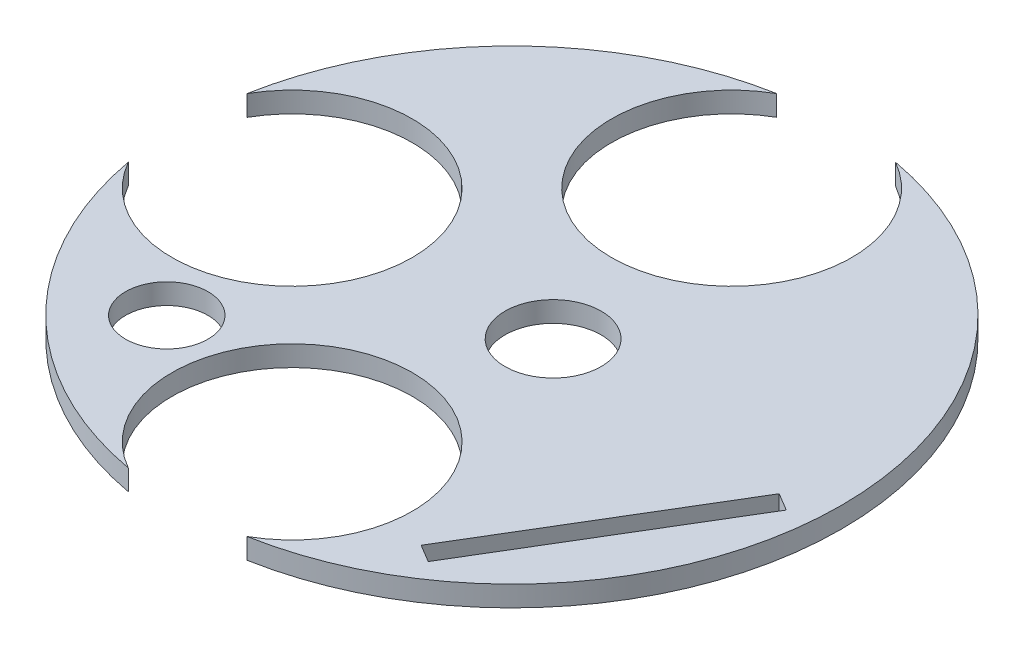
ISO-10303-21;
HEADER;
FILE_DESCRIPTION(('STEP AP214'),'2;1');
FILE_NAME('part.step','',(''),(''),'','','');
FILE_SCHEMA(('AUTOMOTIVE_DESIGN { 1 0 10303 214 1 1 1 1 }'));
ENDSEC;
DATA;
#1=APPLICATION_CONTEXT('core data for automotive mechanical design processes');
#2=APPLICATION_PROTOCOL_DEFINITION('international standard','automotive_design',2000,#1);
#3=PRODUCT_CONTEXT('',#1,'mechanical');
#4=PRODUCT('Part','Part','',(#3));
#5=PRODUCT_RELATED_PRODUCT_CATEGORY('part','',(#4));
#6=PRODUCT_DEFINITION_FORMATION('','',#4);
#7=PRODUCT_DEFINITION_CONTEXT('part definition',#1,'design');
#8=PRODUCT_DEFINITION('design','',#6,#7);
#9=PRODUCT_DEFINITION_SHAPE('','',#8);
#10=(LENGTH_UNIT() NAMED_UNIT(*) SI_UNIT(.MILLI.,.METRE.));
#11=(NAMED_UNIT(*) PLANE_ANGLE_UNIT() SI_UNIT($,.RADIAN.));
#12=(NAMED_UNIT(*) SI_UNIT($,.STERADIAN.) SOLID_ANGLE_UNIT());
#13=UNCERTAINTY_MEASURE_WITH_UNIT(LENGTH_MEASURE(1.E-05),#10,'distance_accuracy_value','');
#14=(GEOMETRIC_REPRESENTATION_CONTEXT(3) GLOBAL_UNCERTAINTY_ASSIGNED_CONTEXT((#13)) GLOBAL_UNIT_ASSIGNED_CONTEXT((#10,
#11,#12)) REPRESENTATION_CONTEXT('',''));
#15=CARTESIAN_POINT('',(0.,0.,0.));
#16=DIRECTION('',(0.,0.,1.));
#17=DIRECTION('',(1.,0.,0.));
#18=AXIS2_PLACEMENT_3D('',#15,#16,#17);
#19=CARTESIAN_POINT('',(4.89286171164571,1.5,-8.14308935667015));
#20=DIRECTION('',(-0.515038074910066,0.,0.857167300702105));
#21=DIRECTION('',(0.857167300702105,0.,0.515038074910066));
#22=AXIS2_PLACEMENT_3D('',#19,#20,#21);
#23=PLANE('',#22);
#24=DIRECTION('',(-0.857167300702105,0.,-0.515038074910066));
#25=VECTOR('',#24,1.);
#26=CARTESIAN_POINT('',(4.89286171164571,0.,-8.14308935667015));
#27=LINE('',#26,#25);
#28=CARTESIAN_POINT('',(22.2857509510532,0.,2.30761283839832));
#29=VERTEX_POINT('',#28);
#30=CARTESIAN_POINT('',(21.,0.,1.53505572603322));
#31=VERTEX_POINT('',#30);
#32=EDGE_CURVE('E180',#29,#31,#27,.T.);
#33=ORIENTED_EDGE('',*,*,#32,.F.);
#34=DIRECTION('',(0.,-1.,0.));
#35=VECTOR('',#34,1.);
#36=CARTESIAN_POINT('',(22.2857509510532,1.5,2.30761283839832));
#37=LINE('',#36,#35);
#38=CARTESIAN_POINT('',(22.2857509510532,1.5,2.30761283839832));
#39=VERTEX_POINT('',#38);
#40=EDGE_CURVE('E11',#39,#29,#37,.T.);
#41=ORIENTED_EDGE('',*,*,#40,.F.);
#42=DIRECTION('',(-0.857167300702105,0.,-0.515038074910066));
#43=VECTOR('',#42,1.);
#44=CARTESIAN_POINT('',(4.89286171164571,1.5,-8.14308935667015));
#45=LINE('',#44,#43);
#46=CARTESIAN_POINT('',(21.,1.5,1.53505572603322));
#47=VERTEX_POINT('',#46);
#48=EDGE_CURVE('E142',#39,#47,#45,.T.);
#49=ORIENTED_EDGE('',*,*,#48,.T.);
#50=DIRECTION('',(0.,-1.,0.));
#51=VECTOR('',#50,1.);
#52=CARTESIAN_POINT('',(21.,1.5,1.53505572603322));
#53=LINE('',#52,#51);
#54=EDGE_CURVE('E61',#47,#31,#53,.T.);
#55=ORIENTED_EDGE('',*,*,#54,.T.);
#56=EDGE_LOOP('',(#33,#41,#49,#55));
#57=FACE_BOUND('',#56,.T.);
#58=ADVANCED_FACE('F41',(#57),#23,.T.);
#59=CARTESIAN_POINT('',(17.3928892394076,1.5,10.4507021950684));
#60=DIRECTION('',(-0.85716730070211,0.,-0.515038074910059));
#61=DIRECTION('',(-0.515038074910059,0.,0.85716730070211));
#62=AXIS2_PLACEMENT_3D('',#59,#60,#61);
#63=PLANE('',#62);
#64=DIRECTION('',(0.515038074910059,0.,-0.85716730070211));
#65=VECTOR('',#64,1.);
#66=CARTESIAN_POINT('',(17.3928892394076,0.,10.4507021950684));
#67=LINE('',#66,#65);
#68=CARTESIAN_POINT('',(12.500027527762,0.,18.5937915517384));
#69=VERTEX_POINT('',#68);
#70=EDGE_CURVE('E130',#69,#29,#67,.T.);
#71=ORIENTED_EDGE('',*,*,#70,.F.);
#72=DIRECTION('',(0.,-1.,0.));
#73=VECTOR('',#72,1.);
#74=CARTESIAN_POINT('',(12.500027527762,1.5,18.5937915517384));
#75=LINE('',#74,#73);
#76=CARTESIAN_POINT('',(12.500027527762,1.5,18.5937915517384));
#77=VERTEX_POINT('',#76);
#78=EDGE_CURVE('E52',#77,#69,#75,.T.);
#79=ORIENTED_EDGE('',*,*,#78,.F.);
#80=DIRECTION('',(0.515038074910059,0.,-0.85716730070211));
#81=VECTOR('',#80,1.);
#82=CARTESIAN_POINT('',(17.3928892394076,1.5,10.4507021950684));
#83=LINE('',#82,#81);
#84=EDGE_CURVE('E128',#77,#39,#83,.T.);
#85=ORIENTED_EDGE('',*,*,#84,.T.);
#86=ORIENTED_EDGE('',*,*,#40,.T.);
#87=EDGE_LOOP('',(#71,#79,#85,#86));
#88=FACE_BOUND('',#87,.T.);
#89=ADVANCED_FACE('F127',(#88),#63,.T.);
#90=CARTESIAN_POINT('',(-4.89286171164558,1.5,8.14308935667026));
#91=DIRECTION('',(0.51503807491005,0.,-0.857167300702115));
#92=DIRECTION('',(-0.857167300702115,0.,-0.51503807491005));
#93=AXIS2_PLACEMENT_3D('',#90,#91,#92);
#94=PLANE('',#93);
#95=DIRECTION('',(0.857167300702115,0.,0.51503807491005));
#96=VECTOR('',#95,1.);
#97=CARTESIAN_POINT('',(-4.89286171164558,0.,8.14308935667026));
#98=LINE('',#97,#96);
#99=CARTESIAN_POINT('',(11.2142765767089,0.,17.8212344393733));
#100=VERTEX_POINT('',#99);
#101=EDGE_CURVE('E185',#100,#69,#98,.T.);
#102=ORIENTED_EDGE('',*,*,#101,.F.);
#103=DIRECTION('',(0.,-1.,0.));
#104=VECTOR('',#103,1.);
#105=CARTESIAN_POINT('',(11.2142765767089,1.5,17.8212344393733));
#106=LINE('',#105,#104);
#107=CARTESIAN_POINT('',(11.2142765767089,1.5,17.8212344393733));
#108=VERTEX_POINT('',#107);
#109=EDGE_CURVE('E92',#108,#100,#106,.T.);
#110=ORIENTED_EDGE('',*,*,#109,.F.);
#111=DIRECTION('',(0.857167300702115,0.,0.51503807491005));
#112=VECTOR('',#111,1.);
#113=CARTESIAN_POINT('',(-4.89286171164558,1.5,8.14308935667026));
#114=LINE('',#113,#112);
#115=EDGE_CURVE('E141',#108,#77,#114,.T.);
#116=ORIENTED_EDGE('',*,*,#115,.T.);
#117=ORIENTED_EDGE('',*,*,#78,.T.);
#118=EDGE_LOOP('',(#102,#110,#116,#117));
#119=FACE_BOUND('',#118,.T.);
#120=ADVANCED_FACE('F145',(#119),#94,.T.);
#121=CARTESIAN_POINT('',(0.,1.5,16.));
#122=DIRECTION('',(0.,-1.,0.));
#123=DIRECTION('',(0.,0.,-1.));
#124=AXIS2_PLACEMENT_3D('',#121,#122,#123);
#125=CYLINDRICAL_SURFACE('',#124,8.75);
#126=CARTESIAN_POINT('',(0.,0.,16.));
#127=DIRECTION('',(0.,1.,0.));
#128=DIRECTION('',(0.,0.,1.));
#129=AXIS2_PLACEMENT_3D('',#126,#127,#128);
#130=CIRCLE('',#129,8.75);
#131=CARTESIAN_POINT('',(4.3231507509884,0.,23.607421875));
#132=VERTEX_POINT('',#131);
#133=CARTESIAN_POINT('',(-4.3231507509884,0.,23.607421875));
#134=VERTEX_POINT('',#133);
#135=EDGE_CURVE('E154',#132,#134,#130,.T.);
#136=ORIENTED_EDGE('',*,*,#135,.F.);
#137=DIRECTION('',(0.,-1.,0.));
#138=VECTOR('',#137,1.);
#139=CARTESIAN_POINT('',(4.3231507509884,1.5,23.607421875));
#140=LINE('',#139,#138);
#141=CARTESIAN_POINT('',(4.3231507509884,1.5,23.607421875));
#142=VERTEX_POINT('',#141);
#143=EDGE_CURVE('E45',#142,#132,#140,.T.);
#144=ORIENTED_EDGE('',*,*,#143,.F.);
#145=CARTESIAN_POINT('',(0.,1.5,16.));
#146=DIRECTION('',(0.,1.,0.));
#147=DIRECTION('',(0.,0.,1.));
#148=AXIS2_PLACEMENT_3D('',#145,#146,#147);
#149=CIRCLE('',#148,8.75);
#150=CARTESIAN_POINT('',(-4.3231507509884,1.5,23.607421875));
#151=VERTEX_POINT('',#150);
#152=EDGE_CURVE('E192',#142,#151,#149,.T.);
#153=ORIENTED_EDGE('',*,*,#152,.T.);
#154=DIRECTION('',(0.,-1.,0.));
#155=VECTOR('',#154,1.);
#156=CARTESIAN_POINT('',(-4.3231507509884,1.5,23.607421875));
#157=LINE('',#156,#155);
#158=EDGE_CURVE('E150',#151,#134,#157,.T.);
#159=ORIENTED_EDGE('',*,*,#158,.T.);
#160=EDGE_LOOP('',(#136,#144,#153,#159));
#161=FACE_BOUND('',#160,.T.);
#162=ADVANCED_FACE('F43',(#161),#125,.F.);
#163=CARTESIAN_POINT('',(0.,1.5,0.));
#164=DIRECTION('',(0.,-1.,0.));
#165=DIRECTION('',(0.,0.,-1.));
#166=AXIS2_PLACEMENT_3D('',#163,#164,#165);
#167=CYLINDRICAL_SURFACE('',#166,24.);
#168=CARTESIAN_POINT('',(0.,0.,0.));
#169=DIRECTION('',(0.,1.,0.));
#170=DIRECTION('',(0.,0.,1.));
#171=AXIS2_PLACEMENT_3D('',#168,#169,#170);
#172=CIRCLE('',#171,24.);
#173=CARTESIAN_POINT('',(4.3231507509884,0.,-23.607421875));
#174=VERTEX_POINT('',#173);
#175=EDGE_CURVE('E158',#132,#174,#172,.T.);
#176=ORIENTED_EDGE('',*,*,#175,.T.);
#177=DIRECTION('',(0.,-1.,0.));
#178=VECTOR('',#177,1.);
#179=CARTESIAN_POINT('',(4.3231507509884,1.5,-23.607421875));
#180=LINE('',#179,#178);
#181=CARTESIAN_POINT('',(4.3231507509884,1.5,-23.607421875));
#182=VERTEX_POINT('',#181);
#183=EDGE_CURVE('E207',#182,#174,#180,.T.);
#184=ORIENTED_EDGE('',*,*,#183,.F.);
#185=CARTESIAN_POINT('',(0.,1.5,0.));
#186=DIRECTION('',(0.,1.,0.));
#187=DIRECTION('',(0.,0.,1.));
#188=AXIS2_PLACEMENT_3D('',#185,#186,#187);
#189=CIRCLE('',#188,24.);
#190=EDGE_CURVE('E217',#142,#182,#189,.T.);
#191=ORIENTED_EDGE('',*,*,#190,.F.);
#192=ORIENTED_EDGE('',*,*,#143,.T.);
#193=EDGE_LOOP('',(#176,#184,#191,#192));
#194=FACE_BOUND('',#193,.T.);
#195=ADVANCED_FACE('F216',(#194),#167,.T.);
#196=CARTESIAN_POINT('',(0.,1.5,-16.));
#197=DIRECTION('',(0.,-1.,0.));
#198=DIRECTION('',(0.,0.,-1.));
#199=AXIS2_PLACEMENT_3D('',#196,#197,#198);
#200=CYLINDRICAL_SURFACE('',#199,8.75);
#201=CARTESIAN_POINT('',(0.,0.,-16.));
#202=DIRECTION('',(0.,1.,0.));
#203=DIRECTION('',(0.,0.,1.));
#204=AXIS2_PLACEMENT_3D('',#201,#202,#203);
#205=CIRCLE('',#204,8.75);
#206=CARTESIAN_POINT('',(-4.3231507509884,0.,-23.607421875));
#207=VERTEX_POINT('',#206);
#208=EDGE_CURVE('E162',#207,#174,#205,.T.);
#209=ORIENTED_EDGE('',*,*,#208,.F.);
#210=DIRECTION('',(0.,-1.,0.));
#211=VECTOR('',#210,1.);
#212=CARTESIAN_POINT('',(-4.3231507509884,1.5,-23.607421875));
#213=LINE('',#212,#211);
#214=CARTESIAN_POINT('',(-4.3231507509884,1.5,-23.607421875));
#215=VERTEX_POINT('',#214);
#216=EDGE_CURVE('E205',#215,#207,#213,.T.);
#217=ORIENTED_EDGE('',*,*,#216,.F.);
#218=CARTESIAN_POINT('',(0.,1.5,-16.));
#219=DIRECTION('',(0.,1.,0.));
#220=DIRECTION('',(0.,0.,1.));
#221=AXIS2_PLACEMENT_3D('',#218,#219,#220);
#222=CIRCLE('',#221,8.75);
#223=EDGE_CURVE('E251',#215,#182,#222,.T.);
#224=ORIENTED_EDGE('',*,*,#223,.T.);
#225=ORIENTED_EDGE('',*,*,#183,.T.);
#226=EDGE_LOOP('',(#209,#217,#224,#225));
#227=FACE_BOUND('',#226,.T.);
#228=ADVANCED_FACE('F288',(#227),#200,.F.);
#229=CARTESIAN_POINT('',(-23.607421875,0.,-4.32315075098838));
#230=VERTEX_POINT('',#229);
#231=EDGE_CURVE('E164',#207,#230,#172,.T.);
#232=ORIENTED_EDGE('',*,*,#231,.T.);
#233=DIRECTION('',(0.,-1.,0.));
#234=VECTOR('',#233,1.);
#235=CARTESIAN_POINT('',(-23.607421875,1.5,-4.32315075098838));
#236=LINE('',#235,#234);
#237=CARTESIAN_POINT('',(-23.607421875,1.5,-4.32315075098838));
#238=VERTEX_POINT('',#237);
#239=EDGE_CURVE('E202',#238,#230,#236,.T.);
#240=ORIENTED_EDGE('',*,*,#239,.F.);
#241=EDGE_CURVE('E245',#215,#238,#189,.T.);
#242=ORIENTED_EDGE('',*,*,#241,.F.);
#243=ORIENTED_EDGE('',*,*,#216,.T.);
#244=EDGE_LOOP('',(#232,#240,#242,#243));
#245=FACE_BOUND('',#244,.T.);
#246=ADVANCED_FACE('F235',(#245),#167,.T.);
#247=CARTESIAN_POINT('',(-16.,1.5,0.));
#248=DIRECTION('',(0.,-1.,0.));
#249=DIRECTION('',(0.,0.,-1.));
#250=AXIS2_PLACEMENT_3D('',#247,#248,#249);
#251=CYLINDRICAL_SURFACE('',#250,8.75);
#252=CARTESIAN_POINT('',(-16.,0.,0.));
#253=DIRECTION('',(0.,1.,0.));
#254=DIRECTION('',(0.,0.,1.));
#255=AXIS2_PLACEMENT_3D('',#252,#253,#254);
#256=CIRCLE('',#255,8.75);
#257=CARTESIAN_POINT('',(-23.607421875,0.,4.32315075098839));
#258=VERTEX_POINT('',#257);
#259=EDGE_CURVE('E168',#258,#230,#256,.T.);
#260=ORIENTED_EDGE('',*,*,#259,.F.);
#261=DIRECTION('',(0.,-1.,0.));
#262=VECTOR('',#261,1.);
#263=CARTESIAN_POINT('',(-23.607421875,1.5,4.32315075098839));
#264=LINE('',#263,#262);
#265=CARTESIAN_POINT('',(-23.607421875,1.5,4.32315075098839));
#266=VERTEX_POINT('',#265);
#267=EDGE_CURVE('E199',#266,#258,#264,.T.);
#268=ORIENTED_EDGE('',*,*,#267,.F.);
#269=CARTESIAN_POINT('',(-16.,1.5,0.));
#270=DIRECTION('',(0.,1.,0.));
#271=DIRECTION('',(0.,0.,1.));
#272=AXIS2_PLACEMENT_3D('',#269,#270,#271);
#273=CIRCLE('',#272,8.75);
#274=EDGE_CURVE('E241',#266,#238,#273,.T.);
#275=ORIENTED_EDGE('',*,*,#274,.T.);
#276=ORIENTED_EDGE('',*,*,#239,.T.);
#277=EDGE_LOOP('',(#260,#268,#275,#276));
#278=FACE_BOUND('',#277,.T.);
#279=ADVANCED_FACE('F239',(#278),#251,.F.);
#280=CARTESIAN_POINT('',(-12.5429192291393,1.5,12.5864078209969));
#281=DIRECTION('',(0.,-1.,0.));
#282=DIRECTION('',(0.,0.,-1.));
#283=AXIS2_PLACEMENT_3D('',#280,#281,#282);
#284=CYLINDRICAL_SURFACE('',#283,3.);
#285=CARTESIAN_POINT('',(-12.5429192291393,1.5,12.5864078209969));
#286=DIRECTION('',(0.,1.,0.));
#287=DIRECTION('',(0.,0.,1.));
#288=AXIS2_PLACEMENT_3D('',#285,#286,#287);
#289=CIRCLE('',#288,3.);
#290=CARTESIAN_POINT('',(-12.5429192291393,1.5,15.5864078209969));
#291=VERTEX_POINT('',#290);
#292=EDGE_CURVE('E257',#291,#291,#289,.T.);
#293=ORIENTED_EDGE('',*,*,#292,.T.);
#294=EDGE_LOOP('',(#293));
#295=FACE_BOUND('',#294,.T.);
#296=CARTESIAN_POINT('',(-12.5429192291393,0.,12.5864078209969));
#297=DIRECTION('',(0.,1.,0.));
#298=DIRECTION('',(0.,0.,1.));
#299=AXIS2_PLACEMENT_3D('',#296,#297,#298);
#300=CIRCLE('',#299,3.);
#301=CARTESIAN_POINT('',(-12.5429192291393,0.,15.5864078209969));
#302=VERTEX_POINT('',#301);
#303=EDGE_CURVE('E176',#302,#302,#300,.T.);
#304=ORIENTED_EDGE('',*,*,#303,.F.);
#305=EDGE_LOOP('',(#304));
#306=FACE_BOUND('',#305,.T.);
#307=ADVANCED_FACE('F280',(#295,#306),#284,.F.);
#308=CARTESIAN_POINT('',(3.,1.5,0.));
#309=DIRECTION('',(0.,-1.,0.));
#310=DIRECTION('',(0.,0.,-1.));
#311=AXIS2_PLACEMENT_3D('',#308,#309,#310);
#312=CYLINDRICAL_SURFACE('',#311,3.5);
#313=CARTESIAN_POINT('',(3.,1.5,0.));
#314=DIRECTION('',(0.,1.,0.));
#315=DIRECTION('',(0.,0.,1.));
#316=AXIS2_PLACEMENT_3D('',#313,#314,#315);
#317=CIRCLE('',#316,3.5);
#318=CARTESIAN_POINT('',(3.,1.5,3.5));
#319=VERTEX_POINT('',#318);
#320=EDGE_CURVE('E249',#319,#319,#317,.T.);
#321=ORIENTED_EDGE('',*,*,#320,.T.);
#322=EDGE_LOOP('',(#321));
#323=FACE_BOUND('',#322,.T.);
#324=CARTESIAN_POINT('',(3.,0.,0.));
#325=DIRECTION('',(0.,1.,0.));
#326=DIRECTION('',(0.,0.,1.));
#327=AXIS2_PLACEMENT_3D('',#324,#325,#326);
#328=CIRCLE('',#327,3.5);
#329=CARTESIAN_POINT('',(3.,0.,3.5));
#330=VERTEX_POINT('',#329);
#331=EDGE_CURVE('E172',#330,#330,#328,.T.);
#332=ORIENTED_EDGE('',*,*,#331,.F.);
#333=EDGE_LOOP('',(#332));
#334=FACE_BOUND('',#333,.T.);
#335=ADVANCED_FACE('F269',(#323,#334),#312,.F.);
#336=EDGE_CURVE('E163',#258,#134,#172,.T.);
#337=ORIENTED_EDGE('',*,*,#336,.T.);
#338=ORIENTED_EDGE('',*,*,#158,.F.);
#339=EDGE_CURVE('E244',#266,#151,#189,.T.);
#340=ORIENTED_EDGE('',*,*,#339,.F.);
#341=ORIENTED_EDGE('',*,*,#267,.T.);
#342=EDGE_LOOP('',(#337,#338,#340,#341));
#343=FACE_BOUND('',#342,.T.);
#344=ADVANCED_FACE('F228',(#343),#167,.T.);
#345=CARTESIAN_POINT('',(16.1071382883544,1.5,9.67814508270328));
#346=DIRECTION('',(0.85716730070211,0.,0.515038074910059));
#347=DIRECTION('',(0.515038074910059,0.,-0.85716730070211));
#348=AXIS2_PLACEMENT_3D('',#345,#346,#347);
#349=PLANE('',#348);
#350=DIRECTION('',(-0.515038074910059,0.,0.85716730070211));
#351=VECTOR('',#350,1.);
#352=CARTESIAN_POINT('',(16.1071382883544,0.,9.67814508270328));
#353=LINE('',#352,#351);
#354=EDGE_CURVE('E188',#31,#100,#353,.T.);
#355=ORIENTED_EDGE('',*,*,#354,.F.);
#356=ORIENTED_EDGE('',*,*,#54,.F.);
#357=DIRECTION('',(-0.515038074910059,0.,0.85716730070211));
#358=VECTOR('',#357,1.);
#359=CARTESIAN_POINT('',(16.1071382883544,1.5,9.67814508270328));
#360=LINE('',#359,#358);
#361=EDGE_CURVE('E147',#47,#108,#360,.T.);
#362=ORIENTED_EDGE('',*,*,#361,.T.);
#363=ORIENTED_EDGE('',*,*,#109,.T.);
#364=EDGE_LOOP('',(#355,#356,#362,#363));
#365=FACE_BOUND('',#364,.T.);
#366=ADVANCED_FACE('F261',(#365),#349,.T.);
#367=CARTESIAN_POINT('',(0.,1.5,0.));
#368=DIRECTION('',(0.,1.,0.));
#369=DIRECTION('',(0.,0.,1.));
#370=AXIS2_PLACEMENT_3D('',#367,#368,#369);
#371=PLANE('',#370);
#372=ORIENTED_EDGE('',*,*,#152,.F.);
#373=ORIENTED_EDGE('',*,*,#190,.T.);
#374=ORIENTED_EDGE('',*,*,#223,.F.);
#375=ORIENTED_EDGE('',*,*,#241,.T.);
#376=ORIENTED_EDGE('',*,*,#274,.F.);
#377=ORIENTED_EDGE('',*,*,#339,.T.);
#378=EDGE_LOOP('',(#372,#373,#374,#375,#376,#377));
#379=FACE_BOUND('',#378,.T.);
#380=ORIENTED_EDGE('',*,*,#320,.F.);
#381=EDGE_LOOP('',(#380));
#382=FACE_BOUND('',#381,.T.);
#383=ORIENTED_EDGE('',*,*,#292,.F.);
#384=EDGE_LOOP('',(#383));
#385=FACE_BOUND('',#384,.T.);
#386=ORIENTED_EDGE('',*,*,#48,.F.);
#387=ORIENTED_EDGE('',*,*,#84,.F.);
#388=ORIENTED_EDGE('',*,*,#115,.F.);
#389=ORIENTED_EDGE('',*,*,#361,.F.);
#390=EDGE_LOOP('',(#386,#387,#388,#389));
#391=FACE_BOUND('',#390,.T.);
#392=ADVANCED_FACE('F139',(#379,#382,#385,#391),#371,.T.);
#393=CARTESIAN_POINT('',(0.,0.,0.));
#394=DIRECTION('',(0.,1.,0.));
#395=DIRECTION('',(0.,0.,1.));
#396=AXIS2_PLACEMENT_3D('',#393,#394,#395);
#397=PLANE('',#396);
#398=ORIENTED_EDGE('',*,*,#135,.T.);
#399=ORIENTED_EDGE('',*,*,#336,.F.);
#400=ORIENTED_EDGE('',*,*,#259,.T.);
#401=ORIENTED_EDGE('',*,*,#231,.F.);
#402=ORIENTED_EDGE('',*,*,#208,.T.);
#403=ORIENTED_EDGE('',*,*,#175,.F.);
#404=EDGE_LOOP('',(#398,#399,#400,#401,#402,#403));
#405=FACE_BOUND('',#404,.T.);
#406=ORIENTED_EDGE('',*,*,#331,.T.);
#407=EDGE_LOOP('',(#406));
#408=FACE_BOUND('',#407,.T.);
#409=ORIENTED_EDGE('',*,*,#303,.T.);
#410=EDGE_LOOP('',(#409));
#411=FACE_BOUND('',#410,.T.);
#412=ORIENTED_EDGE('',*,*,#32,.T.);
#413=ORIENTED_EDGE('',*,*,#354,.T.);
#414=ORIENTED_EDGE('',*,*,#101,.T.);
#415=ORIENTED_EDGE('',*,*,#70,.T.);
#416=EDGE_LOOP('',(#412,#413,#414,#415));
#417=FACE_BOUND('',#416,.T.);
#418=ADVANCED_FACE('F220',(#405,#408,#411,#417),#397,.F.);
#419=CLOSED_SHELL('',(#58,#89,#120,#162,#195,#228,#246,#279,#307,#335,#344,#366,#392,#418));
#420=MANIFOLD_SOLID_BREP('B2',#419);
#421=ADVANCED_BREP_SHAPE_REPRESENTATION('',(#18,#420),#14);
#422=SHAPE_DEFINITION_REPRESENTATION(#9,#421);
ENDSEC;
END-ISO-10303-21;
